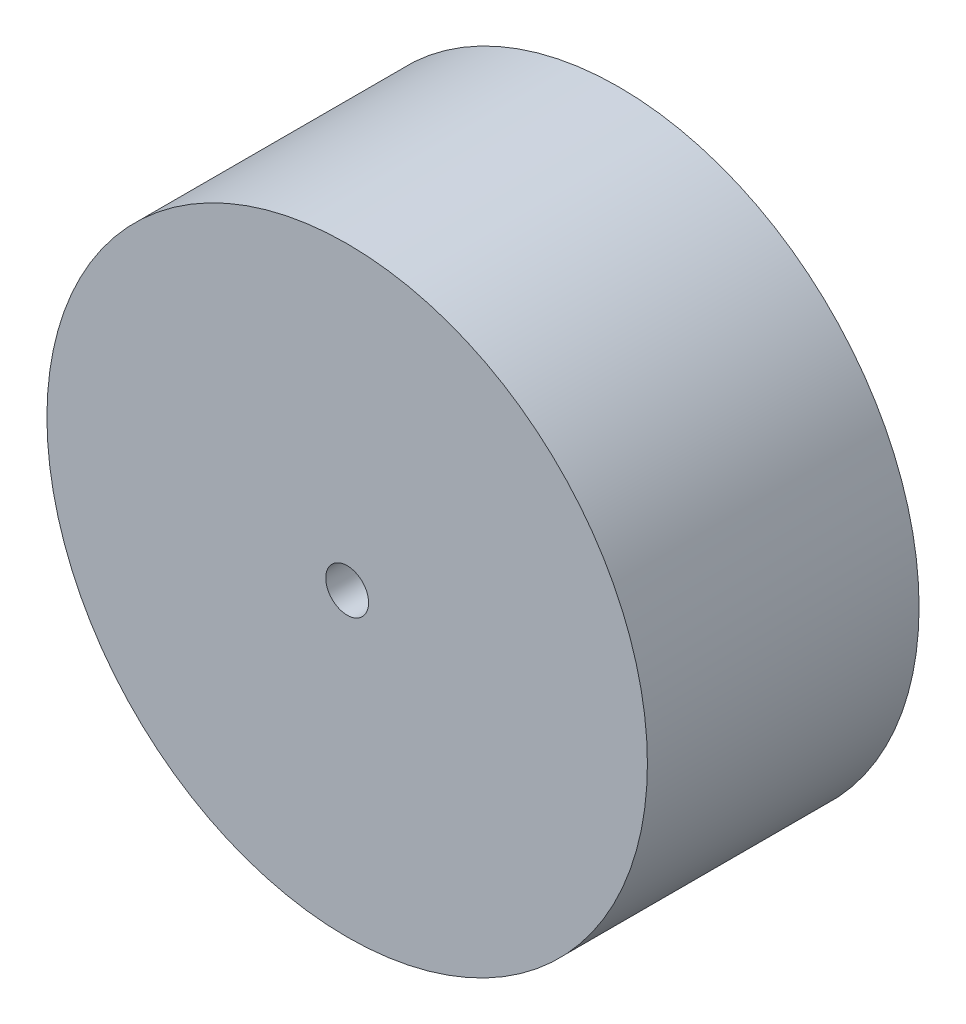
ISO-10303-21;
HEADER;
FILE_DESCRIPTION(('STEP AP214'),'2;1');
FILE_NAME('part.step','',(''),(''),'','','');
FILE_SCHEMA(('AUTOMOTIVE_DESIGN { 1 0 10303 214 1 1 1 1 }'));
ENDSEC;
DATA;
#1=APPLICATION_CONTEXT('core data for automotive mechanical design processes');
#2=APPLICATION_PROTOCOL_DEFINITION('international standard','automotive_design',2000,#1);
#3=PRODUCT_CONTEXT('',#1,'mechanical');
#4=PRODUCT('Part','Part','',(#3));
#5=PRODUCT_RELATED_PRODUCT_CATEGORY('part','',(#4));
#6=PRODUCT_DEFINITION_FORMATION('','',#4);
#7=PRODUCT_DEFINITION_CONTEXT('part definition',#1,'design');
#8=PRODUCT_DEFINITION('design','',#6,#7);
#9=PRODUCT_DEFINITION_SHAPE('','',#8);
#10=(LENGTH_UNIT() NAMED_UNIT(*) SI_UNIT(.MILLI.,.METRE.));
#11=(NAMED_UNIT(*) PLANE_ANGLE_UNIT() SI_UNIT($,.RADIAN.));
#12=(NAMED_UNIT(*) SI_UNIT($,.STERADIAN.) SOLID_ANGLE_UNIT());
#13=UNCERTAINTY_MEASURE_WITH_UNIT(LENGTH_MEASURE(1.E-05),#10,'distance_accuracy_value','');
#14=(GEOMETRIC_REPRESENTATION_CONTEXT(3) GLOBAL_UNCERTAINTY_ASSIGNED_CONTEXT((#13)) GLOBAL_UNIT_ASSIGNED_CONTEXT((#10,
#11,#12)) REPRESENTATION_CONTEXT('',''));
#15=CARTESIAN_POINT('',(0.,0.,0.));
#16=DIRECTION('',(0.,0.,1.));
#17=DIRECTION('',(1.,0.,0.));
#18=AXIS2_PLACEMENT_3D('',#15,#16,#17);
#19=CARTESIAN_POINT('',(0.,0.,19.));
#20=DIRECTION('',(0.,0.,-1.));
#21=DIRECTION('',(-1.,0.,0.));
#22=AXIS2_PLACEMENT_3D('',#19,#20,#21);
#23=CYLINDRICAL_SURFACE('',#22,21.);
#24=CARTESIAN_POINT('',(0.,0.,19.));
#25=DIRECTION('',(0.,0.,1.));
#26=DIRECTION('',(1.,0.,0.));
#27=AXIS2_PLACEMENT_3D('',#24,#25,#26);
#28=CIRCLE('',#27,21.);
#29=CARTESIAN_POINT('',(21.,0.,19.));
#30=VERTEX_POINT('',#29);
#31=EDGE_CURVE('E10',#30,#30,#28,.T.);
#32=ORIENTED_EDGE('',*,*,#31,.F.);
#33=EDGE_LOOP('',(#32));
#34=FACE_BOUND('',#33,.T.);
#35=CARTESIAN_POINT('',(0.,0.,0.));
#36=DIRECTION('',(0.,0.,1.));
#37=DIRECTION('',(1.,0.,0.));
#38=AXIS2_PLACEMENT_3D('',#35,#36,#37);
#39=CIRCLE('',#38,21.);
#40=CARTESIAN_POINT('',(21.,0.,0.));
#41=VERTEX_POINT('',#40);
#42=EDGE_CURVE('E34',#41,#41,#39,.T.);
#43=ORIENTED_EDGE('',*,*,#42,.T.);
#44=EDGE_LOOP('',(#43));
#45=FACE_BOUND('',#44,.T.);
#46=ADVANCED_FACE('F31',(#34,#45),#23,.T.);
#47=CARTESIAN_POINT('',(0.,0.,19.));
#48=DIRECTION('',(0.,0.,1.));
#49=DIRECTION('',(1.,0.,0.));
#50=AXIS2_PLACEMENT_3D('',#47,#48,#49);
#51=PLANE('',#50);
#52=CARTESIAN_POINT('',(0.,0.,19.));
#53=DIRECTION('',(0.,0.,1.));
#54=DIRECTION('',(1.,0.,0.));
#55=AXIS2_PLACEMENT_3D('',#52,#53,#54);
#56=CIRCLE('',#55,1.5);
#57=CARTESIAN_POINT('',(1.5,0.,19.));
#58=VERTEX_POINT('',#57);
#59=EDGE_CURVE('E43',#58,#58,#56,.T.);
#60=ORIENTED_EDGE('',*,*,#59,.F.);
#61=EDGE_LOOP('',(#60));
#62=FACE_BOUND('',#61,.T.);
#63=ORIENTED_EDGE('',*,*,#31,.T.);
#64=EDGE_LOOP('',(#63));
#65=FACE_BOUND('',#64,.T.);
#66=ADVANCED_FACE('F58',(#62,#65),#51,.T.);
#67=CARTESIAN_POINT('',(0.,0.,0.));
#68=DIRECTION('',(0.,0.,1.));
#69=DIRECTION('',(1.,0.,0.));
#70=AXIS2_PLACEMENT_3D('',#67,#68,#69);
#71=PLANE('',#70);
#72=CARTESIAN_POINT('',(0.,0.,0.));
#73=DIRECTION('',(0.,0.,1.));
#74=DIRECTION('',(1.,0.,0.));
#75=AXIS2_PLACEMENT_3D('',#72,#73,#74);
#76=CIRCLE('',#75,1.5);
#77=CARTESIAN_POINT('',(1.5,0.,0.));
#78=VERTEX_POINT('',#77);
#79=EDGE_CURVE('E41',#78,#78,#76,.T.);
#80=ORIENTED_EDGE('',*,*,#79,.T.);
#81=EDGE_LOOP('',(#80));
#82=FACE_BOUND('',#81,.T.);
#83=ORIENTED_EDGE('',*,*,#42,.F.);
#84=EDGE_LOOP('',(#83));
#85=FACE_BOUND('',#84,.T.);
#86=ADVANCED_FACE('F49',(#82,#85),#71,.F.);
#87=CARTESIAN_POINT('',(0.,0.,0.));
#88=DIRECTION('',(0.,0.,1.));
#89=DIRECTION('',(1.,0.,0.));
#90=AXIS2_PLACEMENT_3D('',#87,#88,#89);
#91=CYLINDRICAL_SURFACE('',#90,1.5);
#92=ORIENTED_EDGE('',*,*,#79,.F.);
#93=EDGE_LOOP('',(#92));
#94=FACE_BOUND('',#93,.T.);
#95=ORIENTED_EDGE('',*,*,#59,.T.);
#96=EDGE_LOOP('',(#95));
#97=FACE_BOUND('',#96,.T.);
#98=ADVANCED_FACE('F52',(#94,#97),#91,.F.);
#99=CLOSED_SHELL('',(#46,#66,#86,#98));
#100=MANIFOLD_SOLID_BREP('B2',#99);
#101=ADVANCED_BREP_SHAPE_REPRESENTATION('',(#18,#100),#14);
#102=SHAPE_DEFINITION_REPRESENTATION(#9,#101);
ENDSEC;
END-ISO-10303-21;
